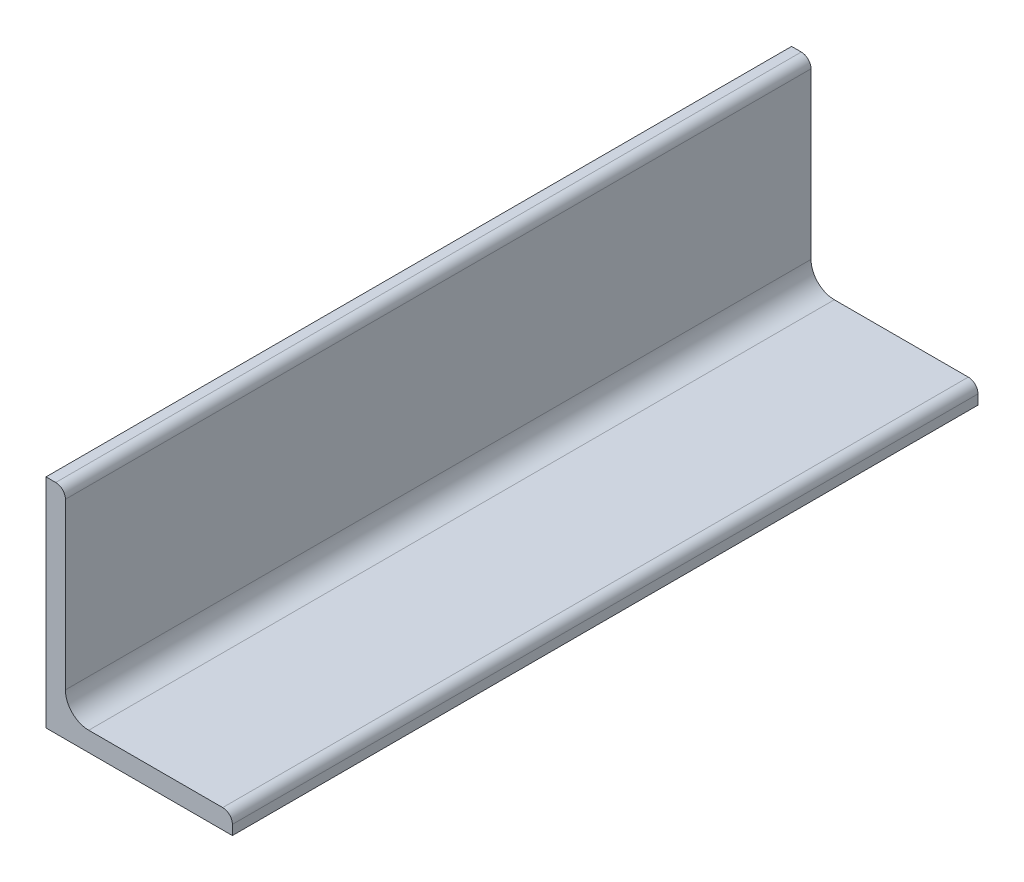
ISO-10303-21;
HEADER;
FILE_DESCRIPTION(('STEP AP214'),'2;1');
FILE_NAME('part.step','',(''),(''),'','','');
FILE_SCHEMA(('AUTOMOTIVE_DESIGN { 1 0 10303 214 1 1 1 1 }'));
ENDSEC;
DATA;
#1=APPLICATION_CONTEXT('core data for automotive mechanical design processes');
#2=APPLICATION_PROTOCOL_DEFINITION('international standard','automotive_design',2000,#1);
#3=PRODUCT_CONTEXT('',#1,'mechanical');
#4=PRODUCT('Part','Part','',(#3));
#5=PRODUCT_RELATED_PRODUCT_CATEGORY('part','',(#4));
#6=PRODUCT_DEFINITION_FORMATION('','',#4);
#7=PRODUCT_DEFINITION_CONTEXT('part definition',#1,'design');
#8=PRODUCT_DEFINITION('design','',#6,#7);
#9=PRODUCT_DEFINITION_SHAPE('','',#8);
#10=(LENGTH_UNIT() NAMED_UNIT(*) SI_UNIT(.MILLI.,.METRE.));
#11=(NAMED_UNIT(*) PLANE_ANGLE_UNIT() SI_UNIT($,.RADIAN.));
#12=(NAMED_UNIT(*) SI_UNIT($,.STERADIAN.) SOLID_ANGLE_UNIT());
#13=UNCERTAINTY_MEASURE_WITH_UNIT(LENGTH_MEASURE(1.E-05),#10,'distance_accuracy_value','');
#14=(GEOMETRIC_REPRESENTATION_CONTEXT(3) GLOBAL_UNCERTAINTY_ASSIGNED_CONTEXT((#13)) GLOBAL_UNIT_ASSIGNED_CONTEXT((#10,
#11,#12)) REPRESENTATION_CONTEXT('',''));
#15=CARTESIAN_POINT('',(0.,0.,0.));
#16=DIRECTION('',(0.,0.,1.));
#17=DIRECTION('',(1.,0.,0.));
#18=AXIS2_PLACEMENT_3D('',#15,#16,#17);
#19=CARTESIAN_POINT('',(0.490776827053332,89.7372005393545,304.8));
#20=DIRECTION('',(1.,0.,0.));
#21=DIRECTION('',(0.,0.,-1.));
#22=AXIS2_PLACEMENT_3D('',#19,#20,#21);
#23=PLANE('',#22);
#24=DIRECTION('',(0.,-1.,0.));
#25=VECTOR('',#24,1.);
#26=CARTESIAN_POINT('',(0.490776827053332,89.7372005393545,0.));
#27=LINE('',#26,#25);
#28=CARTESIAN_POINT('',(0.490776827053332,89.7372005393545,0.));
#29=VERTEX_POINT('',#28);
#30=CARTESIAN_POINT('',(0.490776827053332,0.837200539354535,0.));
#31=VERTEX_POINT('',#30);
#32=EDGE_CURVE('E135',#29,#31,#27,.T.);
#33=ORIENTED_EDGE('',*,*,#32,.T.);
#34=DIRECTION('',(0.,0.,-1.));
#35=VECTOR('',#34,1.);
#36=CARTESIAN_POINT('',(0.490776827053332,0.837200539354535,304.8));
#37=LINE('',#36,#35);
#38=CARTESIAN_POINT('',(0.490776827053332,0.837200539354535,304.8));
#39=VERTEX_POINT('',#38);
#40=EDGE_CURVE('E11',#39,#31,#37,.T.);
#41=ORIENTED_EDGE('',*,*,#40,.F.);
#42=DIRECTION('',(0.,-1.,0.));
#43=VECTOR('',#42,1.);
#44=CARTESIAN_POINT('',(0.490776827053332,89.7372005393545,304.8));
#45=LINE('',#44,#43);
#46=CARTESIAN_POINT('',(0.490776827053332,89.7372005393545,304.8));
#47=VERTEX_POINT('',#46);
#48=EDGE_CURVE('E151',#47,#39,#45,.T.);
#49=ORIENTED_EDGE('',*,*,#48,.F.);
#50=DIRECTION('',(0.,0.,-1.));
#51=VECTOR('',#50,1.);
#52=CARTESIAN_POINT('',(0.490776827053332,89.7372005393545,304.8));
#53=LINE('',#52,#51);
#54=EDGE_CURVE('E131',#47,#29,#53,.T.);
#55=ORIENTED_EDGE('',*,*,#54,.T.);
#56=EDGE_LOOP('',(#33,#41,#49,#55));
#57=FACE_BOUND('',#56,.T.);
#58=ADVANCED_FACE('F33',(#57),#23,.F.);
#59=CARTESIAN_POINT('',(0.490776827053332,0.837200539354535,304.8));
#60=DIRECTION('',(0.,1.,0.));
#61=DIRECTION('',(0.,0.,1.));
#62=AXIS2_PLACEMENT_3D('',#59,#60,#61);
#63=PLANE('',#62);
#64=DIRECTION('',(1.,0.,0.));
#65=VECTOR('',#64,1.);
#66=CARTESIAN_POINT('',(0.490776827053332,0.837200539354535,0.));
#67=LINE('',#66,#65);
#68=CARTESIAN_POINT('',(76.6907768270533,0.837200539354535,0.));
#69=VERTEX_POINT('',#68);
#70=EDGE_CURVE('E138',#31,#69,#67,.T.);
#71=ORIENTED_EDGE('',*,*,#70,.T.);
#72=DIRECTION('',(0.,0.,-1.));
#73=VECTOR('',#72,1.);
#74=CARTESIAN_POINT('',(76.6907768270533,0.837200539354535,304.8));
#75=LINE('',#74,#73);
#76=CARTESIAN_POINT('',(76.6907768270533,0.837200539354535,304.8));
#77=VERTEX_POINT('',#76);
#78=EDGE_CURVE('E41',#77,#69,#75,.T.);
#79=ORIENTED_EDGE('',*,*,#78,.F.);
#80=DIRECTION('',(1.,0.,0.));
#81=VECTOR('',#80,1.);
#82=CARTESIAN_POINT('',(0.490776827053332,0.837200539354535,304.8));
#83=LINE('',#82,#81);
#84=EDGE_CURVE('E95',#39,#77,#83,.T.);
#85=ORIENTED_EDGE('',*,*,#84,.F.);
#86=ORIENTED_EDGE('',*,*,#40,.T.);
#87=EDGE_LOOP('',(#71,#79,#85,#86));
#88=FACE_BOUND('',#87,.T.);
#89=ADVANCED_FACE('F194',(#88),#63,.F.);
#90=CARTESIAN_POINT('',(76.6907768270533,0.837200539354535,304.8));
#91=DIRECTION('',(-1.,0.,0.));
#92=DIRECTION('',(0.,0.,1.));
#93=AXIS2_PLACEMENT_3D('',#90,#91,#92);
#94=PLANE('',#93);
#95=DIRECTION('',(0.,1.,0.));
#96=VECTOR('',#95,1.);
#97=CARTESIAN_POINT('',(76.6907768270533,0.837200539354535,0.));
#98=LINE('',#97,#96);
#99=CARTESIAN_POINT('',(76.6907768270533,4.80595053935453,0.));
#100=VERTEX_POINT('',#99);
#101=EDGE_CURVE('E140',#69,#100,#98,.T.);
#102=ORIENTED_EDGE('',*,*,#101,.T.);
#103=DIRECTION('',(0.,0.,-1.));
#104=VECTOR('',#103,1.);
#105=CARTESIAN_POINT('',(76.6907768270533,4.80595053935453,304.8));
#106=LINE('',#105,#104);
#107=CARTESIAN_POINT('',(76.6907768270533,4.80595053935453,304.8));
#108=VERTEX_POINT('',#107);
#109=EDGE_CURVE('E161',#108,#100,#106,.T.);
#110=ORIENTED_EDGE('',*,*,#109,.F.);
#111=DIRECTION('',(0.,1.,0.));
#112=VECTOR('',#111,1.);
#113=CARTESIAN_POINT('',(76.6907768270533,0.837200539354535,304.8));
#114=LINE('',#113,#112);
#115=EDGE_CURVE('E169',#77,#108,#114,.T.);
#116=ORIENTED_EDGE('',*,*,#115,.F.);
#117=ORIENTED_EDGE('',*,*,#78,.T.);
#118=EDGE_LOOP('',(#102,#110,#116,#117));
#119=FACE_BOUND('',#118,.T.);
#120=ADVANCED_FACE('F167',(#119),#94,.F.);
#121=CARTESIAN_POINT('',(72.7220268270533,4.80595053935453,304.8));
#122=DIRECTION('',(0.,0.,-1.));
#123=DIRECTION('',(-1.,0.,0.));
#124=AXIS2_PLACEMENT_3D('',#121,#122,#123);
#125=CYLINDRICAL_SURFACE('',#124,3.96875);
#126=CARTESIAN_POINT('',(72.7220268270533,4.80595053935453,0.));
#127=DIRECTION('',(0.,0.,1.));
#128=DIRECTION('',(1.,0.,0.));
#129=AXIS2_PLACEMENT_3D('',#126,#127,#128);
#130=CIRCLE('',#129,3.96875);
#131=CARTESIAN_POINT('',(72.7220268270533,8.77470053935454,0.));
#132=VERTEX_POINT('',#131);
#133=EDGE_CURVE('E142',#100,#132,#130,.T.);
#134=ORIENTED_EDGE('',*,*,#133,.T.);
#135=DIRECTION('',(0.,0.,-1.));
#136=VECTOR('',#135,1.);
#137=CARTESIAN_POINT('',(72.7220268270533,8.77470053935454,304.8));
#138=LINE('',#137,#136);
#139=CARTESIAN_POINT('',(72.7220268270533,8.77470053935454,304.8));
#140=VERTEX_POINT('',#139);
#141=EDGE_CURVE('E158',#140,#132,#138,.T.);
#142=ORIENTED_EDGE('',*,*,#141,.F.);
#143=CARTESIAN_POINT('',(72.7220268270533,4.80595053935453,304.8));
#144=DIRECTION('',(0.,0.,1.));
#145=DIRECTION('',(1.,0.,0.));
#146=AXIS2_PLACEMENT_3D('',#143,#144,#145);
#147=CIRCLE('',#146,3.96875);
#148=EDGE_CURVE('E185',#108,#140,#147,.T.);
#149=ORIENTED_EDGE('',*,*,#148,.F.);
#150=ORIENTED_EDGE('',*,*,#109,.T.);
#151=EDGE_LOOP('',(#134,#142,#149,#150));
#152=FACE_BOUND('',#151,.T.);
#153=ADVANCED_FACE('F178',(#152),#125,.T.);
#154=CARTESIAN_POINT('',(72.7220268270533,8.77470053935454,304.8));
#155=DIRECTION('',(0.,-1.,0.));
#156=DIRECTION('',(0.,0.,-1.));
#157=AXIS2_PLACEMENT_3D('',#154,#155,#156);
#158=PLANE('',#157);
#159=DIRECTION('',(-1.,0.,0.));
#160=VECTOR('',#159,1.);
#161=CARTESIAN_POINT('',(72.7220268270533,8.77470053935454,0.));
#162=LINE('',#161,#160);
#163=CARTESIAN_POINT('',(17.9532768270533,8.77470053935454,0.));
#164=VERTEX_POINT('',#163);
#165=EDGE_CURVE('E144',#132,#164,#162,.T.);
#166=ORIENTED_EDGE('',*,*,#165,.T.);
#167=DIRECTION('',(0.,0.,-1.));
#168=VECTOR('',#167,1.);
#169=CARTESIAN_POINT('',(17.9532768270533,8.77470053935454,304.8));
#170=LINE('',#169,#168);
#171=CARTESIAN_POINT('',(17.9532768270533,8.77470053935454,304.8));
#172=VERTEX_POINT('',#171);
#173=EDGE_CURVE('E155',#172,#164,#170,.T.);
#174=ORIENTED_EDGE('',*,*,#173,.F.);
#175=DIRECTION('',(-1.,0.,0.));
#176=VECTOR('',#175,1.);
#177=CARTESIAN_POINT('',(72.7220268270533,8.77470053935454,304.8));
#178=LINE('',#177,#176);
#179=EDGE_CURVE('E184',#140,#172,#178,.T.);
#180=ORIENTED_EDGE('',*,*,#179,.F.);
#181=ORIENTED_EDGE('',*,*,#141,.T.);
#182=EDGE_LOOP('',(#166,#174,#180,#181));
#183=FACE_BOUND('',#182,.T.);
#184=ADVANCED_FACE('F182',(#183),#158,.F.);
#185=CARTESIAN_POINT('',(17.9532768270533,18.2997005393545,304.8));
#186=DIRECTION('',(0.,0.,-1.));
#187=DIRECTION('',(-1.,0.,0.));
#188=AXIS2_PLACEMENT_3D('',#185,#186,#187);
#189=CYLINDRICAL_SURFACE('',#188,9.52499999999999);
#190=CARTESIAN_POINT('',(17.9532768270533,18.2997005393545,0.));
#191=DIRECTION('',(0.,0.,-1.));
#192=DIRECTION('',(1.,0.,0.));
#193=AXIS2_PLACEMENT_3D('',#190,#191,#192);
#194=CIRCLE('',#193,9.52499999999999);
#195=CARTESIAN_POINT('',(8.42827682705333,18.2997005393545,0.));
#196=VERTEX_POINT('',#195);
#197=EDGE_CURVE('E146',#164,#196,#194,.T.);
#198=ORIENTED_EDGE('',*,*,#197,.T.);
#199=DIRECTION('',(0.,0.,-1.));
#200=VECTOR('',#199,1.);
#201=CARTESIAN_POINT('',(8.42827682705333,18.2997005393545,304.8));
#202=LINE('',#201,#200);
#203=CARTESIAN_POINT('',(8.42827682705333,18.2997005393545,304.8));
#204=VERTEX_POINT('',#203);
#205=EDGE_CURVE('E126',#204,#196,#202,.T.);
#206=ORIENTED_EDGE('',*,*,#205,.F.);
#207=CARTESIAN_POINT('',(17.9532768270533,18.2997005393545,304.8));
#208=DIRECTION('',(0.,0.,-1.));
#209=DIRECTION('',(1.,0.,0.));
#210=AXIS2_PLACEMENT_3D('',#207,#208,#209);
#211=CIRCLE('',#210,9.52499999999999);
#212=EDGE_CURVE('E117',#172,#204,#211,.T.);
#213=ORIENTED_EDGE('',*,*,#212,.F.);
#214=ORIENTED_EDGE('',*,*,#173,.T.);
#215=EDGE_LOOP('',(#198,#206,#213,#214));
#216=FACE_BOUND('',#215,.T.);
#217=ADVANCED_FACE('F206',(#216),#189,.F.);
#218=CARTESIAN_POINT('',(8.42827682705333,18.2997005393545,304.8));
#219=DIRECTION('',(-1.,0.,0.));
#220=DIRECTION('',(0.,0.,1.));
#221=AXIS2_PLACEMENT_3D('',#218,#219,#220);
#222=PLANE('',#221);
#223=DIRECTION('',(0.,1.,0.));
#224=VECTOR('',#223,1.);
#225=CARTESIAN_POINT('',(8.42827682705333,18.2997005393545,0.));
#226=LINE('',#225,#224);
#227=CARTESIAN_POINT('',(8.42827682705333,85.7684505393545,0.));
#228=VERTEX_POINT('',#227);
#229=EDGE_CURVE('E125',#196,#228,#226,.T.);
#230=ORIENTED_EDGE('',*,*,#229,.T.);
#231=DIRECTION('',(0.,0.,-1.));
#232=VECTOR('',#231,1.);
#233=CARTESIAN_POINT('',(8.42827682705333,85.7684505393545,304.8));
#234=LINE('',#233,#232);
#235=CARTESIAN_POINT('',(8.42827682705333,85.7684505393545,304.8));
#236=VERTEX_POINT('',#235);
#237=EDGE_CURVE('E122',#236,#228,#234,.T.);
#238=ORIENTED_EDGE('',*,*,#237,.F.);
#239=DIRECTION('',(0.,1.,0.));
#240=VECTOR('',#239,1.);
#241=CARTESIAN_POINT('',(8.42827682705333,18.2997005393545,304.8));
#242=LINE('',#241,#240);
#243=EDGE_CURVE('E111',#204,#236,#242,.T.);
#244=ORIENTED_EDGE('',*,*,#243,.F.);
#245=ORIENTED_EDGE('',*,*,#205,.T.);
#246=EDGE_LOOP('',(#230,#238,#244,#245));
#247=FACE_BOUND('',#246,.T.);
#248=ADVANCED_FACE('F123',(#247),#222,.F.);
#249=CARTESIAN_POINT('',(4.45952682705333,85.7684505393545,304.8));
#250=DIRECTION('',(0.,0.,-1.));
#251=DIRECTION('',(-1.,0.,0.));
#252=AXIS2_PLACEMENT_3D('',#249,#250,#251);
#253=CYLINDRICAL_SURFACE('',#252,3.96875);
#254=CARTESIAN_POINT('',(4.45952682705333,85.7684505393545,0.));
#255=DIRECTION('',(0.,0.,1.));
#256=DIRECTION('',(1.,0.,0.));
#257=AXIS2_PLACEMENT_3D('',#254,#255,#256);
#258=CIRCLE('',#257,3.96875);
#259=CARTESIAN_POINT('',(4.45952682705333,89.7372005393545,0.));
#260=VERTEX_POINT('',#259);
#261=EDGE_CURVE('E81',#228,#260,#258,.T.);
#262=ORIENTED_EDGE('',*,*,#261,.T.);
#263=DIRECTION('',(0.,0.,-1.));
#264=VECTOR('',#263,1.);
#265=CARTESIAN_POINT('',(4.45952682705333,89.7372005393545,304.8));
#266=LINE('',#265,#264);
#267=CARTESIAN_POINT('',(4.45952682705333,89.7372005393545,304.8));
#268=VERTEX_POINT('',#267);
#269=EDGE_CURVE('E127',#268,#260,#266,.T.);
#270=ORIENTED_EDGE('',*,*,#269,.F.);
#271=CARTESIAN_POINT('',(4.45952682705333,85.7684505393545,304.8));
#272=DIRECTION('',(0.,0.,1.));
#273=DIRECTION('',(1.,0.,0.));
#274=AXIS2_PLACEMENT_3D('',#271,#272,#273);
#275=CIRCLE('',#274,3.96875);
#276=EDGE_CURVE('E115',#236,#268,#275,.T.);
#277=ORIENTED_EDGE('',*,*,#276,.F.);
#278=ORIENTED_EDGE('',*,*,#237,.T.);
#279=EDGE_LOOP('',(#262,#270,#277,#278));
#280=FACE_BOUND('',#279,.T.);
#281=ADVANCED_FACE('F129',(#280),#253,.T.);
#282=CARTESIAN_POINT('',(4.45952682705333,89.7372005393545,304.8));
#283=DIRECTION('',(0.,-1.,0.));
#284=DIRECTION('',(0.,0.,-1.));
#285=AXIS2_PLACEMENT_3D('',#282,#283,#284);
#286=PLANE('',#285);
#287=DIRECTION('',(-1.,0.,0.));
#288=VECTOR('',#287,1.);
#289=CARTESIAN_POINT('',(4.45952682705333,89.7372005393545,0.));
#290=LINE('',#289,#288);
#291=EDGE_CURVE('E87',#260,#29,#290,.T.);
#292=ORIENTED_EDGE('',*,*,#291,.T.);
#293=ORIENTED_EDGE('',*,*,#54,.F.);
#294=DIRECTION('',(-1.,0.,0.));
#295=VECTOR('',#294,1.);
#296=CARTESIAN_POINT('',(4.45952682705333,89.7372005393545,304.8));
#297=LINE('',#296,#295);
#298=EDGE_CURVE('E49',#268,#47,#297,.T.);
#299=ORIENTED_EDGE('',*,*,#298,.F.);
#300=ORIENTED_EDGE('',*,*,#269,.T.);
#301=EDGE_LOOP('',(#292,#293,#299,#300));
#302=FACE_BOUND('',#301,.T.);
#303=ADVANCED_FACE('F214',(#302),#286,.F.);
#304=CARTESIAN_POINT('',(72.7220268270533,4.80595053935453,304.8));
#305=DIRECTION('',(0.,0.,1.));
#306=DIRECTION('',(1.,0.,0.));
#307=AXIS2_PLACEMENT_3D('',#304,#305,#306);
#308=PLANE('',#307);
#309=ORIENTED_EDGE('',*,*,#48,.T.);
#310=ORIENTED_EDGE('',*,*,#84,.T.);
#311=ORIENTED_EDGE('',*,*,#115,.T.);
#312=ORIENTED_EDGE('',*,*,#148,.T.);
#313=ORIENTED_EDGE('',*,*,#179,.T.);
#314=ORIENTED_EDGE('',*,*,#212,.T.);
#315=ORIENTED_EDGE('',*,*,#243,.T.);
#316=ORIENTED_EDGE('',*,*,#276,.T.);
#317=ORIENTED_EDGE('',*,*,#298,.T.);
#318=EDGE_LOOP('',(#309,#310,#311,#312,#313,#314,#315,#316,#317));
#319=FACE_BOUND('',#318,.T.);
#320=ADVANCED_FACE('F113',(#319),#308,.T.);
#321=CARTESIAN_POINT('',(72.7220268270533,4.80595053935453,0.));
#322=DIRECTION('',(0.,0.,1.));
#323=DIRECTION('',(1.,0.,0.));
#324=AXIS2_PLACEMENT_3D('',#321,#322,#323);
#325=PLANE('',#324);
#326=ORIENTED_EDGE('',*,*,#32,.F.);
#327=ORIENTED_EDGE('',*,*,#291,.F.);
#328=ORIENTED_EDGE('',*,*,#261,.F.);
#329=ORIENTED_EDGE('',*,*,#229,.F.);
#330=ORIENTED_EDGE('',*,*,#197,.F.);
#331=ORIENTED_EDGE('',*,*,#165,.F.);
#332=ORIENTED_EDGE('',*,*,#133,.F.);
#333=ORIENTED_EDGE('',*,*,#101,.F.);
#334=ORIENTED_EDGE('',*,*,#70,.F.);
#335=EDGE_LOOP('',(#326,#327,#328,#329,#330,#331,#332,#333,#334));
#336=FACE_BOUND('',#335,.T.);
#337=ADVANCED_FACE('F173',(#336),#325,.F.);
#338=CLOSED_SHELL('',(#58,#89,#120,#153,#184,#217,#248,#281,#303,#320,#337));
#339=MANIFOLD_SOLID_BREP('B2',#338);
#340=ADVANCED_BREP_SHAPE_REPRESENTATION('',(#18,#339),#14);
#341=SHAPE_DEFINITION_REPRESENTATION(#9,#340);
ENDSEC;
END-ISO-10303-21;
